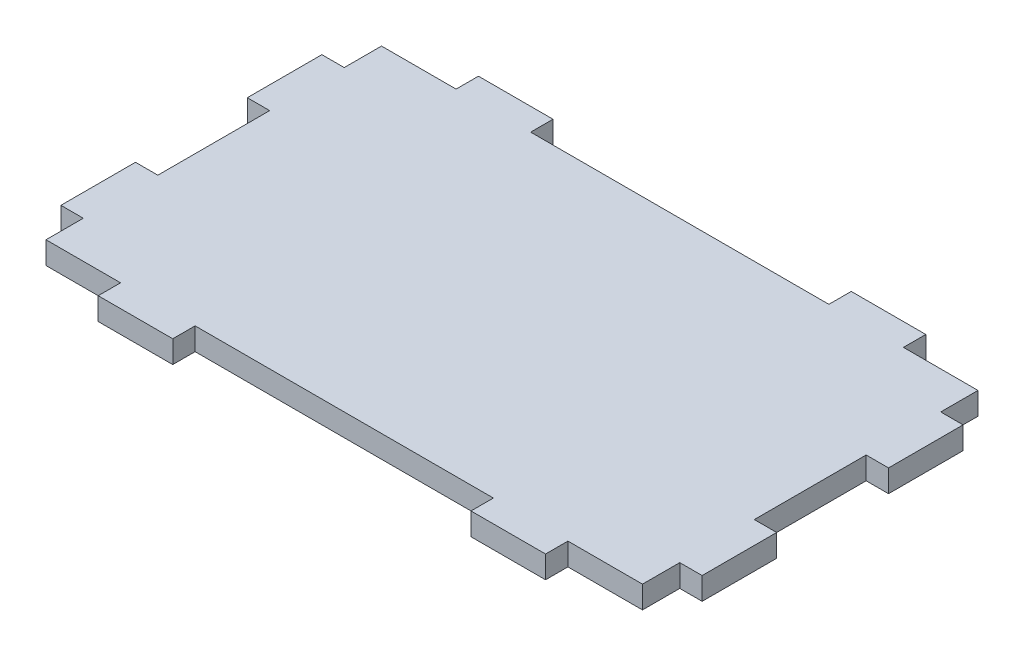
ISO-10303-21;
HEADER;
FILE_DESCRIPTION(('STEP AP214'),'2;1');
FILE_NAME('part.step','',(''),(''),'','','');
FILE_SCHEMA(('AUTOMOTIVE_DESIGN { 1 0 10303 214 1 1 1 1 }'));
ENDSEC;
DATA;
#1=APPLICATION_CONTEXT('core data for automotive mechanical design processes');
#2=APPLICATION_PROTOCOL_DEFINITION('international standard','automotive_design',2000,#1);
#3=PRODUCT_CONTEXT('',#1,'mechanical');
#4=PRODUCT('Part','Part','',(#3));
#5=PRODUCT_RELATED_PRODUCT_CATEGORY('part','',(#4));
#6=PRODUCT_DEFINITION_FORMATION('','',#4);
#7=PRODUCT_DEFINITION_CONTEXT('part definition',#1,'design');
#8=PRODUCT_DEFINITION('design','',#6,#7);
#9=PRODUCT_DEFINITION_SHAPE('','',#8);
#10=(LENGTH_UNIT() NAMED_UNIT(*) SI_UNIT(.MILLI.,.METRE.));
#11=(NAMED_UNIT(*) PLANE_ANGLE_UNIT() SI_UNIT($,.RADIAN.));
#12=(NAMED_UNIT(*) SI_UNIT($,.STERADIAN.) SOLID_ANGLE_UNIT());
#13=UNCERTAINTY_MEASURE_WITH_UNIT(LENGTH_MEASURE(1.E-05),#10,'distance_accuracy_value','');
#14=(GEOMETRIC_REPRESENTATION_CONTEXT(3) GLOBAL_UNCERTAINTY_ASSIGNED_CONTEXT((#13)) GLOBAL_UNIT_ASSIGNED_CONTEXT((#10,
#11,#12)) REPRESENTATION_CONTEXT('',''));
#15=CARTESIAN_POINT('',(0.,0.,0.));
#16=DIRECTION('',(0.,0.,1.));
#17=DIRECTION('',(1.,0.,0.));
#18=AXIS2_PLACEMENT_3D('',#15,#16,#17);
#19=CARTESIAN_POINT('',(0.,3.,0.));
#20=DIRECTION('',(1.,0.,0.));
#21=DIRECTION('',(0.,0.,-1.));
#22=AXIS2_PLACEMENT_3D('',#19,#20,#21);
#23=PLANE('',#22);
#24=DIRECTION('',(0.,0.,1.));
#25=VECTOR('',#24,1.);
#26=CARTESIAN_POINT('',(0.,0.,0.));
#27=LINE('',#26,#25);
#28=CARTESIAN_POINT('',(0.,0.,-5.));
#29=VERTEX_POINT('',#28);
#30=CARTESIAN_POINT('',(0.,0.,0.));
#31=VERTEX_POINT('',#30);
#32=EDGE_CURVE('E297',#29,#31,#27,.T.);
#33=ORIENTED_EDGE('',*,*,#32,.T.);
#34=DIRECTION('',(0.,-1.,0.));
#35=VECTOR('',#34,1.);
#36=CARTESIAN_POINT('',(0.,3.,0.));
#37=LINE('',#36,#35);
#38=CARTESIAN_POINT('',(0.,3.,0.));
#39=VERTEX_POINT('',#38);
#40=EDGE_CURVE('E11',#39,#31,#37,.T.);
#41=ORIENTED_EDGE('',*,*,#40,.F.);
#42=DIRECTION('',(0.,0.,1.));
#43=VECTOR('',#42,1.);
#44=CARTESIAN_POINT('',(0.,3.,0.));
#45=LINE('',#44,#43);
#46=CARTESIAN_POINT('',(0.,3.,-5.));
#47=VERTEX_POINT('',#46);
#48=EDGE_CURVE('E367',#47,#39,#45,.T.);
#49=ORIENTED_EDGE('',*,*,#48,.F.);
#50=DIRECTION('',(0.,-1.,0.));
#51=VECTOR('',#50,1.);
#52=CARTESIAN_POINT('',(0.,3.,-5.));
#53=LINE('',#52,#51);
#54=EDGE_CURVE('E293',#47,#29,#53,.T.);
#55=ORIENTED_EDGE('',*,*,#54,.T.);
#56=EDGE_LOOP('',(#33,#41,#49,#55));
#57=FACE_BOUND('',#56,.T.);
#58=ADVANCED_FACE('F33',(#57),#23,.F.);
#59=CARTESIAN_POINT('',(0.,3.,0.));
#60=DIRECTION('',(0.,0.,-1.));
#61=DIRECTION('',(-1.,0.,0.));
#62=AXIS2_PLACEMENT_3D('',#59,#60,#61);
#63=PLANE('',#62);
#64=DIRECTION('',(1.,0.,0.));
#65=VECTOR('',#64,1.);
#66=CARTESIAN_POINT('',(0.,0.,0.));
#67=LINE('',#66,#65);
#68=CARTESIAN_POINT('',(10.,0.,0.));
#69=VERTEX_POINT('',#68);
#70=EDGE_CURVE('E300',#31,#69,#67,.T.);
#71=ORIENTED_EDGE('',*,*,#70,.T.);
#72=DIRECTION('',(0.,-1.,0.));
#73=VECTOR('',#72,1.);
#74=CARTESIAN_POINT('',(10.,3.,0.));
#75=LINE('',#74,#73);
#76=CARTESIAN_POINT('',(10.,3.,0.));
#77=VERTEX_POINT('',#76);
#78=EDGE_CURVE('E41',#77,#69,#75,.T.);
#79=ORIENTED_EDGE('',*,*,#78,.F.);
#80=DIRECTION('',(1.,0.,0.));
#81=VECTOR('',#80,1.);
#82=CARTESIAN_POINT('',(0.,3.,0.));
#83=LINE('',#82,#81);
#84=EDGE_CURVE('E176',#39,#77,#83,.T.);
#85=ORIENTED_EDGE('',*,*,#84,.F.);
#86=ORIENTED_EDGE('',*,*,#40,.T.);
#87=EDGE_LOOP('',(#71,#79,#85,#86));
#88=FACE_BOUND('',#87,.T.);
#89=ADVANCED_FACE('F565',(#88),#63,.F.);
#90=CARTESIAN_POINT('',(10.,3.,0.));
#91=DIRECTION('',(1.,0.,0.));
#92=DIRECTION('',(0.,0.,-1.));
#93=AXIS2_PLACEMENT_3D('',#90,#91,#92);
#94=PLANE('',#93);
#95=DIRECTION('',(0.,0.,1.));
#96=VECTOR('',#95,1.);
#97=CARTESIAN_POINT('',(10.,0.,0.));
#98=LINE('',#97,#96);
#99=CARTESIAN_POINT('',(10.,0.,3.));
#100=VERTEX_POINT('',#99);
#101=EDGE_CURVE('E302',#69,#100,#98,.T.);
#102=ORIENTED_EDGE('',*,*,#101,.T.);
#103=DIRECTION('',(0.,-1.,0.));
#104=VECTOR('',#103,1.);
#105=CARTESIAN_POINT('',(10.,3.,3.));
#106=LINE('',#105,#104);
#107=CARTESIAN_POINT('',(10.,3.,3.));
#108=VERTEX_POINT('',#107);
#109=EDGE_CURVE('E458',#108,#100,#106,.T.);
#110=ORIENTED_EDGE('',*,*,#109,.F.);
#111=DIRECTION('',(0.,0.,1.));
#112=VECTOR('',#111,1.);
#113=CARTESIAN_POINT('',(10.,3.,0.));
#114=LINE('',#113,#112);
#115=EDGE_CURVE('E466',#77,#108,#114,.T.);
#116=ORIENTED_EDGE('',*,*,#115,.F.);
#117=ORIENTED_EDGE('',*,*,#78,.T.);
#118=EDGE_LOOP('',(#102,#110,#116,#117));
#119=FACE_BOUND('',#118,.T.);
#120=ADVANCED_FACE('F464',(#119),#94,.F.);
#121=CARTESIAN_POINT('',(10.,3.,3.));
#122=DIRECTION('',(0.,0.,-1.));
#123=DIRECTION('',(-1.,0.,0.));
#124=AXIS2_PLACEMENT_3D('',#121,#122,#123);
#125=PLANE('',#124);
#126=DIRECTION('',(1.,0.,0.));
#127=VECTOR('',#126,1.);
#128=CARTESIAN_POINT('',(10.,0.,3.));
#129=LINE('',#128,#127);
#130=CARTESIAN_POINT('',(20.,0.,3.));
#131=VERTEX_POINT('',#130);
#132=EDGE_CURVE('E304',#100,#131,#129,.T.);
#133=ORIENTED_EDGE('',*,*,#132,.T.);
#134=DIRECTION('',(0.,-1.,0.));
#135=VECTOR('',#134,1.);
#136=CARTESIAN_POINT('',(20.,3.,3.));
#137=LINE('',#136,#135);
#138=CARTESIAN_POINT('',(20.,3.,3.));
#139=VERTEX_POINT('',#138);
#140=EDGE_CURVE('E455',#139,#131,#137,.T.);
#141=ORIENTED_EDGE('',*,*,#140,.F.);
#142=DIRECTION('',(1.,0.,0.));
#143=VECTOR('',#142,1.);
#144=CARTESIAN_POINT('',(10.,3.,3.));
#145=LINE('',#144,#143);
#146=EDGE_CURVE('E484',#108,#139,#145,.T.);
#147=ORIENTED_EDGE('',*,*,#146,.F.);
#148=ORIENTED_EDGE('',*,*,#109,.T.);
#149=EDGE_LOOP('',(#133,#141,#147,#148));
#150=FACE_BOUND('',#149,.T.);
#151=ADVANCED_FACE('F475',(#150),#125,.F.);
#152=CARTESIAN_POINT('',(20.,3.,0.));
#153=DIRECTION('',(-1.,0.,0.));
#154=DIRECTION('',(0.,0.,1.));
#155=AXIS2_PLACEMENT_3D('',#152,#153,#154);
#156=PLANE('',#155);
#157=DIRECTION('',(0.,0.,-1.));
#158=VECTOR('',#157,1.);
#159=CARTESIAN_POINT('',(20.,0.,0.));
#160=LINE('',#159,#158);
#161=CARTESIAN_POINT('',(20.,0.,0.));
#162=VERTEX_POINT('',#161);
#163=EDGE_CURVE('E306',#131,#162,#160,.T.);
#164=ORIENTED_EDGE('',*,*,#163,.T.);
#165=DIRECTION('',(0.,-1.,0.));
#166=VECTOR('',#165,1.);
#167=CARTESIAN_POINT('',(20.,3.,0.));
#168=LINE('',#167,#166);
#169=CARTESIAN_POINT('',(20.,3.,0.));
#170=VERTEX_POINT('',#169);
#171=EDGE_CURVE('E452',#170,#162,#168,.T.);
#172=ORIENTED_EDGE('',*,*,#171,.F.);
#173=DIRECTION('',(0.,0.,-1.));
#174=VECTOR('',#173,1.);
#175=CARTESIAN_POINT('',(20.,3.,0.));
#176=LINE('',#175,#174);
#177=EDGE_CURVE('E481',#139,#170,#176,.T.);
#178=ORIENTED_EDGE('',*,*,#177,.F.);
#179=ORIENTED_EDGE('',*,*,#140,.T.);
#180=EDGE_LOOP('',(#164,#172,#178,#179));
#181=FACE_BOUND('',#180,.T.);
#182=ADVANCED_FACE('F479',(#181),#156,.F.);
#183=CARTESIAN_POINT('',(20.,3.,0.));
#184=DIRECTION('',(0.,0.,-1.));
#185=DIRECTION('',(-1.,0.,0.));
#186=AXIS2_PLACEMENT_3D('',#183,#184,#185);
#187=PLANE('',#186);
#188=DIRECTION('',(1.,0.,0.));
#189=VECTOR('',#188,1.);
#190=CARTESIAN_POINT('',(20.,0.,0.));
#191=LINE('',#190,#189);
#192=CARTESIAN_POINT('',(60.,0.,0.));
#193=VERTEX_POINT('',#192);
#194=EDGE_CURVE('E308',#162,#193,#191,.T.);
#195=ORIENTED_EDGE('',*,*,#194,.T.);
#196=DIRECTION('',(0.,-1.,0.));
#197=VECTOR('',#196,1.);
#198=CARTESIAN_POINT('',(60.,3.,0.));
#199=LINE('',#198,#197);
#200=CARTESIAN_POINT('',(60.,3.,0.));
#201=VERTEX_POINT('',#200);
#202=EDGE_CURVE('E449',#201,#193,#199,.T.);
#203=ORIENTED_EDGE('',*,*,#202,.F.);
#204=DIRECTION('',(1.,0.,0.));
#205=VECTOR('',#204,1.);
#206=CARTESIAN_POINT('',(20.,3.,0.));
#207=LINE('',#206,#205);
#208=EDGE_CURVE('E483',#170,#201,#207,.T.);
#209=ORIENTED_EDGE('',*,*,#208,.F.);
#210=ORIENTED_EDGE('',*,*,#171,.T.);
#211=EDGE_LOOP('',(#195,#203,#209,#210));
#212=FACE_BOUND('',#211,.T.);
#213=ADVANCED_FACE('F578',(#212),#187,.F.);
#214=CARTESIAN_POINT('',(60.,3.,0.));
#215=DIRECTION('',(1.,0.,0.));
#216=DIRECTION('',(0.,0.,-1.));
#217=AXIS2_PLACEMENT_3D('',#214,#215,#216);
#218=PLANE('',#217);
#219=DIRECTION('',(0.,0.,1.));
#220=VECTOR('',#219,1.);
#221=CARTESIAN_POINT('',(60.,0.,0.));
#222=LINE('',#221,#220);
#223=CARTESIAN_POINT('',(60.,0.,3.));
#224=VERTEX_POINT('',#223);
#225=EDGE_CURVE('E310',#193,#224,#222,.T.);
#226=ORIENTED_EDGE('',*,*,#225,.T.);
#227=DIRECTION('',(0.,-1.,0.));
#228=VECTOR('',#227,1.);
#229=CARTESIAN_POINT('',(60.,3.,3.));
#230=LINE('',#229,#228);
#231=CARTESIAN_POINT('',(60.,3.,3.));
#232=VERTEX_POINT('',#231);
#233=EDGE_CURVE('E446',#232,#224,#230,.T.);
#234=ORIENTED_EDGE('',*,*,#233,.F.);
#235=DIRECTION('',(0.,0.,1.));
#236=VECTOR('',#235,1.);
#237=CARTESIAN_POINT('',(60.,3.,0.));
#238=LINE('',#237,#236);
#239=EDGE_CURVE('E486',#201,#232,#238,.T.);
#240=ORIENTED_EDGE('',*,*,#239,.F.);
#241=ORIENTED_EDGE('',*,*,#202,.T.);
#242=EDGE_LOOP('',(#226,#234,#240,#241));
#243=FACE_BOUND('',#242,.T.);
#244=ADVANCED_FACE('F581',(#243),#218,.F.);
#245=CARTESIAN_POINT('',(60.,3.,3.));
#246=DIRECTION('',(0.,0.,-1.));
#247=DIRECTION('',(-1.,0.,0.));
#248=AXIS2_PLACEMENT_3D('',#245,#246,#247);
#249=PLANE('',#248);
#250=DIRECTION('',(1.,0.,0.));
#251=VECTOR('',#250,1.);
#252=CARTESIAN_POINT('',(60.,0.,3.));
#253=LINE('',#252,#251);
#254=CARTESIAN_POINT('',(70.,0.,3.));
#255=VERTEX_POINT('',#254);
#256=EDGE_CURVE('E312',#224,#255,#253,.T.);
#257=ORIENTED_EDGE('',*,*,#256,.T.);
#258=DIRECTION('',(0.,-1.,0.));
#259=VECTOR('',#258,1.);
#260=CARTESIAN_POINT('',(70.,3.,3.));
#261=LINE('',#260,#259);
#262=CARTESIAN_POINT('',(70.,3.,3.));
#263=VERTEX_POINT('',#262);
#264=EDGE_CURVE('E443',#263,#255,#261,.T.);
#265=ORIENTED_EDGE('',*,*,#264,.F.);
#266=DIRECTION('',(1.,0.,0.));
#267=VECTOR('',#266,1.);
#268=CARTESIAN_POINT('',(60.,3.,3.));
#269=LINE('',#268,#267);
#270=EDGE_CURVE('E492',#232,#263,#269,.T.);
#271=ORIENTED_EDGE('',*,*,#270,.F.);
#272=ORIENTED_EDGE('',*,*,#233,.T.);
#273=EDGE_LOOP('',(#257,#265,#271,#272));
#274=FACE_BOUND('',#273,.T.);
#275=ADVANCED_FACE('F585',(#274),#249,.F.);
#276=CARTESIAN_POINT('',(70.,3.,0.));
#277=DIRECTION('',(-1.,0.,0.));
#278=DIRECTION('',(0.,0.,1.));
#279=AXIS2_PLACEMENT_3D('',#276,#277,#278);
#280=PLANE('',#279);
#281=DIRECTION('',(0.,0.,-1.));
#282=VECTOR('',#281,1.);
#283=CARTESIAN_POINT('',(70.,0.,0.));
#284=LINE('',#283,#282);
#285=CARTESIAN_POINT('',(70.,0.,0.));
#286=VERTEX_POINT('',#285);
#287=EDGE_CURVE('E314',#255,#286,#284,.T.);
#288=ORIENTED_EDGE('',*,*,#287,.T.);
#289=DIRECTION('',(0.,-1.,0.));
#290=VECTOR('',#289,1.);
#291=CARTESIAN_POINT('',(70.,3.,0.));
#292=LINE('',#291,#290);
#293=CARTESIAN_POINT('',(70.,3.,0.));
#294=VERTEX_POINT('',#293);
#295=EDGE_CURVE('E440',#294,#286,#292,.T.);
#296=ORIENTED_EDGE('',*,*,#295,.F.);
#297=DIRECTION('',(0.,0.,-1.));
#298=VECTOR('',#297,1.);
#299=CARTESIAN_POINT('',(70.,3.,0.));
#300=LINE('',#299,#298);
#301=EDGE_CURVE('E494',#263,#294,#300,.T.);
#302=ORIENTED_EDGE('',*,*,#301,.F.);
#303=ORIENTED_EDGE('',*,*,#264,.T.);
#304=EDGE_LOOP('',(#288,#296,#302,#303));
#305=FACE_BOUND('',#304,.T.);
#306=ADVANCED_FACE('F589',(#305),#280,.F.);
#307=CARTESIAN_POINT('',(70.,3.,0.));
#308=DIRECTION('',(0.,0.,-1.));
#309=DIRECTION('',(-1.,0.,0.));
#310=AXIS2_PLACEMENT_3D('',#307,#308,#309);
#311=PLANE('',#310);
#312=DIRECTION('',(1.,0.,0.));
#313=VECTOR('',#312,1.);
#314=CARTESIAN_POINT('',(70.,0.,0.));
#315=LINE('',#314,#313);
#316=CARTESIAN_POINT('',(80.,0.,0.));
#317=VERTEX_POINT('',#316);
#318=EDGE_CURVE('E316',#286,#317,#315,.T.);
#319=ORIENTED_EDGE('',*,*,#318,.T.);
#320=DIRECTION('',(0.,-1.,0.));
#321=VECTOR('',#320,1.);
#322=CARTESIAN_POINT('',(80.,3.,0.));
#323=LINE('',#322,#321);
#324=CARTESIAN_POINT('',(80.,3.,0.));
#325=VERTEX_POINT('',#324);
#326=EDGE_CURVE('E437',#325,#317,#323,.T.);
#327=ORIENTED_EDGE('',*,*,#326,.F.);
#328=DIRECTION('',(1.,0.,0.));
#329=VECTOR('',#328,1.);
#330=CARTESIAN_POINT('',(70.,3.,0.));
#331=LINE('',#330,#329);
#332=EDGE_CURVE('E496',#294,#325,#331,.T.);
#333=ORIENTED_EDGE('',*,*,#332,.F.);
#334=ORIENTED_EDGE('',*,*,#295,.T.);
#335=EDGE_LOOP('',(#319,#327,#333,#334));
#336=FACE_BOUND('',#335,.T.);
#337=ADVANCED_FACE('F593',(#336),#311,.F.);
#338=CARTESIAN_POINT('',(80.,3.,0.));
#339=DIRECTION('',(-1.,0.,0.));
#340=DIRECTION('',(0.,0.,1.));
#341=AXIS2_PLACEMENT_3D('',#338,#339,#340);
#342=PLANE('',#341);
#343=DIRECTION('',(0.,0.,-1.));
#344=VECTOR('',#343,1.);
#345=CARTESIAN_POINT('',(80.,0.,0.));
#346=LINE('',#345,#344);
#347=CARTESIAN_POINT('',(80.,0.,-5.));
#348=VERTEX_POINT('',#347);
#349=EDGE_CURVE('E318',#317,#348,#346,.T.);
#350=ORIENTED_EDGE('',*,*,#349,.T.);
#351=DIRECTION('',(0.,-1.,0.));
#352=VECTOR('',#351,1.);
#353=CARTESIAN_POINT('',(80.,3.,-5.));
#354=LINE('',#353,#352);
#355=CARTESIAN_POINT('',(80.,3.,-5.));
#356=VERTEX_POINT('',#355);
#357=EDGE_CURVE('E434',#356,#348,#354,.T.);
#358=ORIENTED_EDGE('',*,*,#357,.F.);
#359=DIRECTION('',(0.,0.,-1.));
#360=VECTOR('',#359,1.);
#361=CARTESIAN_POINT('',(80.,3.,0.));
#362=LINE('',#361,#360);
#363=EDGE_CURVE('E498',#325,#356,#362,.T.);
#364=ORIENTED_EDGE('',*,*,#363,.F.);
#365=ORIENTED_EDGE('',*,*,#326,.T.);
#366=EDGE_LOOP('',(#350,#358,#364,#365));
#367=FACE_BOUND('',#366,.T.);
#368=ADVANCED_FACE('F597',(#367),#342,.F.);
#369=CARTESIAN_POINT('',(80.,3.,-5.));
#370=DIRECTION('',(0.,0.,-1.));
#371=DIRECTION('',(-1.,0.,0.));
#372=AXIS2_PLACEMENT_3D('',#369,#370,#371);
#373=PLANE('',#372);
#374=DIRECTION('',(1.,0.,0.));
#375=VECTOR('',#374,1.);
#376=CARTESIAN_POINT('',(80.,0.,-5.));
#377=LINE('',#376,#375);
#378=CARTESIAN_POINT('',(83.,0.,-5.));
#379=VERTEX_POINT('',#378);
#380=EDGE_CURVE('E320',#348,#379,#377,.T.);
#381=ORIENTED_EDGE('',*,*,#380,.T.);
#382=DIRECTION('',(0.,-1.,0.));
#383=VECTOR('',#382,1.);
#384=CARTESIAN_POINT('',(83.,3.,-5.));
#385=LINE('',#384,#383);
#386=CARTESIAN_POINT('',(83.,3.,-5.));
#387=VERTEX_POINT('',#386);
#388=EDGE_CURVE('E431',#387,#379,#385,.T.);
#389=ORIENTED_EDGE('',*,*,#388,.F.);
#390=DIRECTION('',(1.,0.,0.));
#391=VECTOR('',#390,1.);
#392=CARTESIAN_POINT('',(80.,3.,-5.));
#393=LINE('',#392,#391);
#394=EDGE_CURVE('E500',#356,#387,#393,.T.);
#395=ORIENTED_EDGE('',*,*,#394,.F.);
#396=ORIENTED_EDGE('',*,*,#357,.T.);
#397=EDGE_LOOP('',(#381,#389,#395,#396));
#398=FACE_BOUND('',#397,.T.);
#399=ADVANCED_FACE('F601',(#398),#373,.F.);
#400=CARTESIAN_POINT('',(83.,3.,-15.));
#401=DIRECTION('',(-1.,0.,0.));
#402=DIRECTION('',(0.,0.,1.));
#403=AXIS2_PLACEMENT_3D('',#400,#401,#402);
#404=PLANE('',#403);
#405=DIRECTION('',(0.,0.,-1.));
#406=VECTOR('',#405,1.);
#407=CARTESIAN_POINT('',(83.,0.,-15.));
#408=LINE('',#407,#406);
#409=CARTESIAN_POINT('',(83.,0.,-15.));
#410=VERTEX_POINT('',#409);
#411=EDGE_CURVE('E322',#379,#410,#408,.T.);
#412=ORIENTED_EDGE('',*,*,#411,.T.);
#413=DIRECTION('',(0.,-1.,0.));
#414=VECTOR('',#413,1.);
#415=CARTESIAN_POINT('',(83.,3.,-15.));
#416=LINE('',#415,#414);
#417=CARTESIAN_POINT('',(83.,3.,-15.));
#418=VERTEX_POINT('',#417);
#419=EDGE_CURVE('E428',#418,#410,#416,.T.);
#420=ORIENTED_EDGE('',*,*,#419,.F.);
#421=DIRECTION('',(0.,0.,-1.));
#422=VECTOR('',#421,1.);
#423=CARTESIAN_POINT('',(83.,3.,-15.));
#424=LINE('',#423,#422);
#425=EDGE_CURVE('E502',#387,#418,#424,.T.);
#426=ORIENTED_EDGE('',*,*,#425,.F.);
#427=ORIENTED_EDGE('',*,*,#388,.T.);
#428=EDGE_LOOP('',(#412,#420,#426,#427));
#429=FACE_BOUND('',#428,.T.);
#430=ADVANCED_FACE('F605',(#429),#404,.F.);
#431=CARTESIAN_POINT('',(80.,3.,-15.));
#432=DIRECTION('',(0.,0.,1.));
#433=DIRECTION('',(1.,0.,0.));
#434=AXIS2_PLACEMENT_3D('',#431,#432,#433);
#435=PLANE('',#434);
#436=DIRECTION('',(-1.,0.,0.));
#437=VECTOR('',#436,1.);
#438=CARTESIAN_POINT('',(80.,0.,-15.));
#439=LINE('',#438,#437);
#440=CARTESIAN_POINT('',(80.,0.,-15.));
#441=VERTEX_POINT('',#440);
#442=EDGE_CURVE('E324',#410,#441,#439,.T.);
#443=ORIENTED_EDGE('',*,*,#442,.T.);
#444=DIRECTION('',(0.,-1.,0.));
#445=VECTOR('',#444,1.);
#446=CARTESIAN_POINT('',(80.,3.,-15.));
#447=LINE('',#446,#445);
#448=CARTESIAN_POINT('',(80.,3.,-15.));
#449=VERTEX_POINT('',#448);
#450=EDGE_CURVE('E425',#449,#441,#447,.T.);
#451=ORIENTED_EDGE('',*,*,#450,.F.);
#452=DIRECTION('',(-1.,0.,0.));
#453=VECTOR('',#452,1.);
#454=CARTESIAN_POINT('',(80.,3.,-15.));
#455=LINE('',#454,#453);
#456=EDGE_CURVE('E504',#418,#449,#455,.T.);
#457=ORIENTED_EDGE('',*,*,#456,.F.);
#458=ORIENTED_EDGE('',*,*,#419,.T.);
#459=EDGE_LOOP('',(#443,#451,#457,#458));
#460=FACE_BOUND('',#459,.T.);
#461=ADVANCED_FACE('F609',(#460),#435,.F.);
#462=CARTESIAN_POINT('',(80.,3.,-15.));
#463=DIRECTION('',(-1.,0.,0.));
#464=DIRECTION('',(0.,0.,1.));
#465=AXIS2_PLACEMENT_3D('',#462,#463,#464);
#466=PLANE('',#465);
#467=DIRECTION('',(0.,0.,-1.));
#468=VECTOR('',#467,1.);
#469=CARTESIAN_POINT('',(80.,0.,-15.));
#470=LINE('',#469,#468);
#471=CARTESIAN_POINT('',(80.,0.,-30.));
#472=VERTEX_POINT('',#471);
#473=EDGE_CURVE('E326',#441,#472,#470,.T.);
#474=ORIENTED_EDGE('',*,*,#473,.T.);
#475=DIRECTION('',(0.,-1.,0.));
#476=VECTOR('',#475,1.);
#477=CARTESIAN_POINT('',(80.,3.,-30.));
#478=LINE('',#477,#476);
#479=CARTESIAN_POINT('',(80.,3.,-30.));
#480=VERTEX_POINT('',#479);
#481=EDGE_CURVE('E422',#480,#472,#478,.T.);
#482=ORIENTED_EDGE('',*,*,#481,.F.);
#483=DIRECTION('',(0.,0.,-1.));
#484=VECTOR('',#483,1.);
#485=CARTESIAN_POINT('',(80.,3.,-15.));
#486=LINE('',#485,#484);
#487=EDGE_CURVE('E506',#449,#480,#486,.T.);
#488=ORIENTED_EDGE('',*,*,#487,.F.);
#489=ORIENTED_EDGE('',*,*,#450,.T.);
#490=EDGE_LOOP('',(#474,#482,#488,#489));
#491=FACE_BOUND('',#490,.T.);
#492=ADVANCED_FACE('F613',(#491),#466,.F.);
#493=CARTESIAN_POINT('',(80.,3.,-30.));
#494=DIRECTION('',(0.,0.,-1.));
#495=DIRECTION('',(-1.,0.,0.));
#496=AXIS2_PLACEMENT_3D('',#493,#494,#495);
#497=PLANE('',#496);
#498=DIRECTION('',(1.,0.,0.));
#499=VECTOR('',#498,1.);
#500=CARTESIAN_POINT('',(80.,0.,-30.));
#501=LINE('',#500,#499);
#502=CARTESIAN_POINT('',(83.,0.,-30.));
#503=VERTEX_POINT('',#502);
#504=EDGE_CURVE('E328',#472,#503,#501,.T.);
#505=ORIENTED_EDGE('',*,*,#504,.T.);
#506=DIRECTION('',(0.,-1.,0.));
#507=VECTOR('',#506,1.);
#508=CARTESIAN_POINT('',(83.,3.,-30.));
#509=LINE('',#508,#507);
#510=CARTESIAN_POINT('',(83.,3.,-30.));
#511=VERTEX_POINT('',#510);
#512=EDGE_CURVE('E419',#511,#503,#509,.T.);
#513=ORIENTED_EDGE('',*,*,#512,.F.);
#514=DIRECTION('',(1.,0.,0.));
#515=VECTOR('',#514,1.);
#516=CARTESIAN_POINT('',(80.,3.,-30.));
#517=LINE('',#516,#515);
#518=EDGE_CURVE('E508',#480,#511,#517,.T.);
#519=ORIENTED_EDGE('',*,*,#518,.F.);
#520=ORIENTED_EDGE('',*,*,#481,.T.);
#521=EDGE_LOOP('',(#505,#513,#519,#520));
#522=FACE_BOUND('',#521,.T.);
#523=ADVANCED_FACE('F617',(#522),#497,.F.);
#524=CARTESIAN_POINT('',(83.,3.,-40.));
#525=DIRECTION('',(-1.,0.,0.));
#526=DIRECTION('',(0.,0.,1.));
#527=AXIS2_PLACEMENT_3D('',#524,#525,#526);
#528=PLANE('',#527);
#529=DIRECTION('',(0.,0.,-1.));
#530=VECTOR('',#529,1.);
#531=CARTESIAN_POINT('',(83.,0.,-40.));
#532=LINE('',#531,#530);
#533=CARTESIAN_POINT('',(83.,0.,-40.));
#534=VERTEX_POINT('',#533);
#535=EDGE_CURVE('E330',#503,#534,#532,.T.);
#536=ORIENTED_EDGE('',*,*,#535,.T.);
#537=DIRECTION('',(0.,-1.,0.));
#538=VECTOR('',#537,1.);
#539=CARTESIAN_POINT('',(83.,3.,-40.));
#540=LINE('',#539,#538);
#541=CARTESIAN_POINT('',(83.,3.,-40.));
#542=VERTEX_POINT('',#541);
#543=EDGE_CURVE('E416',#542,#534,#540,.T.);
#544=ORIENTED_EDGE('',*,*,#543,.F.);
#545=DIRECTION('',(0.,0.,-1.));
#546=VECTOR('',#545,1.);
#547=CARTESIAN_POINT('',(83.,3.,-40.));
#548=LINE('',#547,#546);
#549=EDGE_CURVE('E510',#511,#542,#548,.T.);
#550=ORIENTED_EDGE('',*,*,#549,.F.);
#551=ORIENTED_EDGE('',*,*,#512,.T.);
#552=EDGE_LOOP('',(#536,#544,#550,#551));
#553=FACE_BOUND('',#552,.T.);
#554=ADVANCED_FACE('F621',(#553),#528,.F.);
#555=CARTESIAN_POINT('',(80.,3.,-40.));
#556=DIRECTION('',(0.,0.,1.));
#557=DIRECTION('',(1.,0.,0.));
#558=AXIS2_PLACEMENT_3D('',#555,#556,#557);
#559=PLANE('',#558);
#560=DIRECTION('',(-1.,0.,0.));
#561=VECTOR('',#560,1.);
#562=CARTESIAN_POINT('',(80.,0.,-40.));
#563=LINE('',#562,#561);
#564=CARTESIAN_POINT('',(80.,0.,-40.));
#565=VERTEX_POINT('',#564);
#566=EDGE_CURVE('E332',#534,#565,#563,.T.);
#567=ORIENTED_EDGE('',*,*,#566,.T.);
#568=DIRECTION('',(0.,-1.,0.));
#569=VECTOR('',#568,1.);
#570=CARTESIAN_POINT('',(80.,3.,-40.));
#571=LINE('',#570,#569);
#572=CARTESIAN_POINT('',(80.,3.,-40.));
#573=VERTEX_POINT('',#572);
#574=EDGE_CURVE('E413',#573,#565,#571,.T.);
#575=ORIENTED_EDGE('',*,*,#574,.F.);
#576=DIRECTION('',(-1.,0.,0.));
#577=VECTOR('',#576,1.);
#578=CARTESIAN_POINT('',(80.,3.,-40.));
#579=LINE('',#578,#577);
#580=EDGE_CURVE('E512',#542,#573,#579,.T.);
#581=ORIENTED_EDGE('',*,*,#580,.F.);
#582=ORIENTED_EDGE('',*,*,#543,.T.);
#583=EDGE_LOOP('',(#567,#575,#581,#582));
#584=FACE_BOUND('',#583,.T.);
#585=ADVANCED_FACE('F625',(#584),#559,.F.);
#586=CARTESIAN_POINT('',(80.,3.,-40.));
#587=DIRECTION('',(-1.,0.,0.));
#588=DIRECTION('',(0.,0.,1.));
#589=AXIS2_PLACEMENT_3D('',#586,#587,#588);
#590=PLANE('',#589);
#591=DIRECTION('',(0.,0.,-1.));
#592=VECTOR('',#591,1.);
#593=CARTESIAN_POINT('',(80.,0.,-40.));
#594=LINE('',#593,#592);
#595=CARTESIAN_POINT('',(80.,0.,-45.));
#596=VERTEX_POINT('',#595);
#597=EDGE_CURVE('E334',#565,#596,#594,.T.);
#598=ORIENTED_EDGE('',*,*,#597,.T.);
#599=DIRECTION('',(0.,-1.,0.));
#600=VECTOR('',#599,1.);
#601=CARTESIAN_POINT('',(80.,3.,-45.));
#602=LINE('',#601,#600);
#603=CARTESIAN_POINT('',(80.,3.,-45.));
#604=VERTEX_POINT('',#603);
#605=EDGE_CURVE('E410',#604,#596,#602,.T.);
#606=ORIENTED_EDGE('',*,*,#605,.F.);
#607=DIRECTION('',(0.,0.,-1.));
#608=VECTOR('',#607,1.);
#609=CARTESIAN_POINT('',(80.,3.,-40.));
#610=LINE('',#609,#608);
#611=EDGE_CURVE('E514',#573,#604,#610,.T.);
#612=ORIENTED_EDGE('',*,*,#611,.F.);
#613=ORIENTED_EDGE('',*,*,#574,.T.);
#614=EDGE_LOOP('',(#598,#606,#612,#613));
#615=FACE_BOUND('',#614,.T.);
#616=ADVANCED_FACE('F629',(#615),#590,.F.);
#617=CARTESIAN_POINT('',(70.,3.,-45.));
#618=DIRECTION('',(0.,0.,1.));
#619=DIRECTION('',(1.,0.,0.));
#620=AXIS2_PLACEMENT_3D('',#617,#618,#619);
#621=PLANE('',#620);
#622=DIRECTION('',(-1.,0.,0.));
#623=VECTOR('',#622,1.);
#624=CARTESIAN_POINT('',(70.,0.,-45.));
#625=LINE('',#624,#623);
#626=CARTESIAN_POINT('',(70.,0.,-45.));
#627=VERTEX_POINT('',#626);
#628=EDGE_CURVE('E336',#596,#627,#625,.T.);
#629=ORIENTED_EDGE('',*,*,#628,.T.);
#630=DIRECTION('',(0.,-1.,0.));
#631=VECTOR('',#630,1.);
#632=CARTESIAN_POINT('',(70.,3.,-45.));
#633=LINE('',#632,#631);
#634=CARTESIAN_POINT('',(70.,3.,-45.));
#635=VERTEX_POINT('',#634);
#636=EDGE_CURVE('E407',#635,#627,#633,.T.);
#637=ORIENTED_EDGE('',*,*,#636,.F.);
#638=DIRECTION('',(-1.,0.,0.));
#639=VECTOR('',#638,1.);
#640=CARTESIAN_POINT('',(70.,3.,-45.));
#641=LINE('',#640,#639);
#642=EDGE_CURVE('E516',#604,#635,#641,.T.);
#643=ORIENTED_EDGE('',*,*,#642,.F.);
#644=ORIENTED_EDGE('',*,*,#605,.T.);
#645=EDGE_LOOP('',(#629,#637,#643,#644));
#646=FACE_BOUND('',#645,.T.);
#647=ADVANCED_FACE('F633',(#646),#621,.F.);
#648=CARTESIAN_POINT('',(70.,3.,-45.));
#649=DIRECTION('',(-1.,0.,0.));
#650=DIRECTION('',(0.,0.,1.));
#651=AXIS2_PLACEMENT_3D('',#648,#649,#650);
#652=PLANE('',#651);
#653=DIRECTION('',(0.,0.,-1.));
#654=VECTOR('',#653,1.);
#655=CARTESIAN_POINT('',(70.,0.,-45.));
#656=LINE('',#655,#654);
#657=CARTESIAN_POINT('',(70.,0.,-48.));
#658=VERTEX_POINT('',#657);
#659=EDGE_CURVE('E338',#627,#658,#656,.T.);
#660=ORIENTED_EDGE('',*,*,#659,.T.);
#661=DIRECTION('',(0.,-1.,0.));
#662=VECTOR('',#661,1.);
#663=CARTESIAN_POINT('',(70.,3.,-48.));
#664=LINE('',#663,#662);
#665=CARTESIAN_POINT('',(70.,3.,-48.));
#666=VERTEX_POINT('',#665);
#667=EDGE_CURVE('E404',#666,#658,#664,.T.);
#668=ORIENTED_EDGE('',*,*,#667,.F.);
#669=DIRECTION('',(0.,0.,-1.));
#670=VECTOR('',#669,1.);
#671=CARTESIAN_POINT('',(70.,3.,-45.));
#672=LINE('',#671,#670);
#673=EDGE_CURVE('E518',#635,#666,#672,.T.);
#674=ORIENTED_EDGE('',*,*,#673,.F.);
#675=ORIENTED_EDGE('',*,*,#636,.T.);
#676=EDGE_LOOP('',(#660,#668,#674,#675));
#677=FACE_BOUND('',#676,.T.);
#678=ADVANCED_FACE('F637',(#677),#652,.F.);
#679=CARTESIAN_POINT('',(60.,3.,-48.));
#680=DIRECTION('',(0.,0.,1.));
#681=DIRECTION('',(1.,0.,0.));
#682=AXIS2_PLACEMENT_3D('',#679,#680,#681);
#683=PLANE('',#682);
#684=DIRECTION('',(-1.,0.,0.));
#685=VECTOR('',#684,1.);
#686=CARTESIAN_POINT('',(60.,0.,-48.));
#687=LINE('',#686,#685);
#688=CARTESIAN_POINT('',(60.,0.,-48.));
#689=VERTEX_POINT('',#688);
#690=EDGE_CURVE('E340',#658,#689,#687,.T.);
#691=ORIENTED_EDGE('',*,*,#690,.T.);
#692=DIRECTION('',(0.,-1.,0.));
#693=VECTOR('',#692,1.);
#694=CARTESIAN_POINT('',(60.,3.,-48.));
#695=LINE('',#694,#693);
#696=CARTESIAN_POINT('',(60.,3.,-48.));
#697=VERTEX_POINT('',#696);
#698=EDGE_CURVE('E401',#697,#689,#695,.T.);
#699=ORIENTED_EDGE('',*,*,#698,.F.);
#700=DIRECTION('',(-1.,0.,0.));
#701=VECTOR('',#700,1.);
#702=CARTESIAN_POINT('',(60.,3.,-48.));
#703=LINE('',#702,#701);
#704=EDGE_CURVE('E520',#666,#697,#703,.T.);
#705=ORIENTED_EDGE('',*,*,#704,.F.);
#706=ORIENTED_EDGE('',*,*,#667,.T.);
#707=EDGE_LOOP('',(#691,#699,#705,#706));
#708=FACE_BOUND('',#707,.T.);
#709=ADVANCED_FACE('F641',(#708),#683,.F.);
#710=CARTESIAN_POINT('',(60.,3.,-45.));
#711=DIRECTION('',(1.,0.,0.));
#712=DIRECTION('',(0.,0.,-1.));
#713=AXIS2_PLACEMENT_3D('',#710,#711,#712);
#714=PLANE('',#713);
#715=DIRECTION('',(0.,0.,1.));
#716=VECTOR('',#715,1.);
#717=CARTESIAN_POINT('',(60.,0.,-45.));
#718=LINE('',#717,#716);
#719=CARTESIAN_POINT('',(60.,0.,-45.));
#720=VERTEX_POINT('',#719);
#721=EDGE_CURVE('E342',#689,#720,#718,.T.);
#722=ORIENTED_EDGE('',*,*,#721,.T.);
#723=DIRECTION('',(0.,-1.,0.));
#724=VECTOR('',#723,1.);
#725=CARTESIAN_POINT('',(60.,3.,-45.));
#726=LINE('',#725,#724);
#727=CARTESIAN_POINT('',(60.,3.,-45.));
#728=VERTEX_POINT('',#727);
#729=EDGE_CURVE('E398',#728,#720,#726,.T.);
#730=ORIENTED_EDGE('',*,*,#729,.F.);
#731=DIRECTION('',(0.,0.,1.));
#732=VECTOR('',#731,1.);
#733=CARTESIAN_POINT('',(60.,3.,-45.));
#734=LINE('',#733,#732);
#735=EDGE_CURVE('E522',#697,#728,#734,.T.);
#736=ORIENTED_EDGE('',*,*,#735,.F.);
#737=ORIENTED_EDGE('',*,*,#698,.T.);
#738=EDGE_LOOP('',(#722,#730,#736,#737));
#739=FACE_BOUND('',#738,.T.);
#740=ADVANCED_FACE('F645',(#739),#714,.F.);
#741=CARTESIAN_POINT('',(20.,3.,-45.));
#742=DIRECTION('',(0.,0.,1.));
#743=DIRECTION('',(1.,0.,0.));
#744=AXIS2_PLACEMENT_3D('',#741,#742,#743);
#745=PLANE('',#744);
#746=DIRECTION('',(-1.,0.,0.));
#747=VECTOR('',#746,1.);
#748=CARTESIAN_POINT('',(20.,0.,-45.));
#749=LINE('',#748,#747);
#750=CARTESIAN_POINT('',(20.,0.,-45.));
#751=VERTEX_POINT('',#750);
#752=EDGE_CURVE('E344',#720,#751,#749,.T.);
#753=ORIENTED_EDGE('',*,*,#752,.T.);
#754=DIRECTION('',(0.,-1.,0.));
#755=VECTOR('',#754,1.);
#756=CARTESIAN_POINT('',(20.,3.,-45.));
#757=LINE('',#756,#755);
#758=CARTESIAN_POINT('',(20.,3.,-45.));
#759=VERTEX_POINT('',#758);
#760=EDGE_CURVE('E395',#759,#751,#757,.T.);
#761=ORIENTED_EDGE('',*,*,#760,.F.);
#762=DIRECTION('',(-1.,0.,0.));
#763=VECTOR('',#762,1.);
#764=CARTESIAN_POINT('',(20.,3.,-45.));
#765=LINE('',#764,#763);
#766=EDGE_CURVE('E524',#728,#759,#765,.T.);
#767=ORIENTED_EDGE('',*,*,#766,.F.);
#768=ORIENTED_EDGE('',*,*,#729,.T.);
#769=EDGE_LOOP('',(#753,#761,#767,#768));
#770=FACE_BOUND('',#769,.T.);
#771=ADVANCED_FACE('F649',(#770),#745,.F.);
#772=CARTESIAN_POINT('',(20.,3.,-45.));
#773=DIRECTION('',(-1.,0.,0.));
#774=DIRECTION('',(0.,0.,1.));
#775=AXIS2_PLACEMENT_3D('',#772,#773,#774);
#776=PLANE('',#775);
#777=DIRECTION('',(0.,0.,-1.));
#778=VECTOR('',#777,1.);
#779=CARTESIAN_POINT('',(20.,0.,-45.));
#780=LINE('',#779,#778);
#781=CARTESIAN_POINT('',(20.,0.,-48.));
#782=VERTEX_POINT('',#781);
#783=EDGE_CURVE('E346',#751,#782,#780,.T.);
#784=ORIENTED_EDGE('',*,*,#783,.T.);
#785=DIRECTION('',(0.,-1.,0.));
#786=VECTOR('',#785,1.);
#787=CARTESIAN_POINT('',(20.,3.,-48.));
#788=LINE('',#787,#786);
#789=CARTESIAN_POINT('',(20.,3.,-48.));
#790=VERTEX_POINT('',#789);
#791=EDGE_CURVE('E392',#790,#782,#788,.T.);
#792=ORIENTED_EDGE('',*,*,#791,.F.);
#793=DIRECTION('',(0.,0.,-1.));
#794=VECTOR('',#793,1.);
#795=CARTESIAN_POINT('',(20.,3.,-45.));
#796=LINE('',#795,#794);
#797=EDGE_CURVE('E526',#759,#790,#796,.T.);
#798=ORIENTED_EDGE('',*,*,#797,.F.);
#799=ORIENTED_EDGE('',*,*,#760,.T.);
#800=EDGE_LOOP('',(#784,#792,#798,#799));
#801=FACE_BOUND('',#800,.T.);
#802=ADVANCED_FACE('F653',(#801),#776,.F.);
#803=CARTESIAN_POINT('',(10.,3.,-48.));
#804=DIRECTION('',(0.,0.,1.));
#805=DIRECTION('',(1.,0.,0.));
#806=AXIS2_PLACEMENT_3D('',#803,#804,#805);
#807=PLANE('',#806);
#808=DIRECTION('',(-1.,0.,0.));
#809=VECTOR('',#808,1.);
#810=CARTESIAN_POINT('',(10.,0.,-48.));
#811=LINE('',#810,#809);
#812=CARTESIAN_POINT('',(10.,0.,-48.));
#813=VERTEX_POINT('',#812);
#814=EDGE_CURVE('E348',#782,#813,#811,.T.);
#815=ORIENTED_EDGE('',*,*,#814,.T.);
#816=DIRECTION('',(0.,-1.,0.));
#817=VECTOR('',#816,1.);
#818=CARTESIAN_POINT('',(10.,3.,-48.));
#819=LINE('',#818,#817);
#820=CARTESIAN_POINT('',(10.,3.,-48.));
#821=VERTEX_POINT('',#820);
#822=EDGE_CURVE('E389',#821,#813,#819,.T.);
#823=ORIENTED_EDGE('',*,*,#822,.F.);
#824=DIRECTION('',(-1.,0.,0.));
#825=VECTOR('',#824,1.);
#826=CARTESIAN_POINT('',(10.,3.,-48.));
#827=LINE('',#826,#825);
#828=EDGE_CURVE('E528',#790,#821,#827,.T.);
#829=ORIENTED_EDGE('',*,*,#828,.F.);
#830=ORIENTED_EDGE('',*,*,#791,.T.);
#831=EDGE_LOOP('',(#815,#823,#829,#830));
#832=FACE_BOUND('',#831,.T.);
#833=ADVANCED_FACE('F657',(#832),#807,.F.);
#834=CARTESIAN_POINT('',(10.,3.,-45.));
#835=DIRECTION('',(1.,0.,0.));
#836=DIRECTION('',(0.,0.,-1.));
#837=AXIS2_PLACEMENT_3D('',#834,#835,#836);
#838=PLANE('',#837);
#839=DIRECTION('',(0.,0.,1.));
#840=VECTOR('',#839,1.);
#841=CARTESIAN_POINT('',(10.,0.,-45.));
#842=LINE('',#841,#840);
#843=CARTESIAN_POINT('',(10.,0.,-45.));
#844=VERTEX_POINT('',#843);
#845=EDGE_CURVE('E350',#813,#844,#842,.T.);
#846=ORIENTED_EDGE('',*,*,#845,.T.);
#847=DIRECTION('',(0.,-1.,0.));
#848=VECTOR('',#847,1.);
#849=CARTESIAN_POINT('',(10.,3.,-45.));
#850=LINE('',#849,#848);
#851=CARTESIAN_POINT('',(10.,3.,-45.));
#852=VERTEX_POINT('',#851);
#853=EDGE_CURVE('E386',#852,#844,#850,.T.);
#854=ORIENTED_EDGE('',*,*,#853,.F.);
#855=DIRECTION('',(0.,0.,1.));
#856=VECTOR('',#855,1.);
#857=CARTESIAN_POINT('',(10.,3.,-45.));
#858=LINE('',#857,#856);
#859=EDGE_CURVE('E530',#821,#852,#858,.T.);
#860=ORIENTED_EDGE('',*,*,#859,.F.);
#861=ORIENTED_EDGE('',*,*,#822,.T.);
#862=EDGE_LOOP('',(#846,#854,#860,#861));
#863=FACE_BOUND('',#862,.T.);
#864=ADVANCED_FACE('F661',(#863),#838,.F.);
#865=CARTESIAN_POINT('',(0.,3.,-45.));
#866=DIRECTION('',(0.,0.,1.));
#867=DIRECTION('',(1.,0.,0.));
#868=AXIS2_PLACEMENT_3D('',#865,#866,#867);
#869=PLANE('',#868);
#870=DIRECTION('',(-1.,0.,0.));
#871=VECTOR('',#870,1.);
#872=CARTESIAN_POINT('',(0.,0.,-45.));
#873=LINE('',#872,#871);
#874=CARTESIAN_POINT('',(0.,0.,-45.));
#875=VERTEX_POINT('',#874);
#876=EDGE_CURVE('E352',#844,#875,#873,.T.);
#877=ORIENTED_EDGE('',*,*,#876,.T.);
#878=DIRECTION('',(0.,-1.,0.));
#879=VECTOR('',#878,1.);
#880=CARTESIAN_POINT('',(0.,3.,-45.));
#881=LINE('',#880,#879);
#882=CARTESIAN_POINT('',(0.,3.,-45.));
#883=VERTEX_POINT('',#882);
#884=EDGE_CURVE('E383',#883,#875,#881,.T.);
#885=ORIENTED_EDGE('',*,*,#884,.F.);
#886=DIRECTION('',(-1.,0.,0.));
#887=VECTOR('',#886,1.);
#888=CARTESIAN_POINT('',(0.,3.,-45.));
#889=LINE('',#888,#887);
#890=EDGE_CURVE('E532',#852,#883,#889,.T.);
#891=ORIENTED_EDGE('',*,*,#890,.F.);
#892=ORIENTED_EDGE('',*,*,#853,.T.);
#893=EDGE_LOOP('',(#877,#885,#891,#892));
#894=FACE_BOUND('',#893,.T.);
#895=ADVANCED_FACE('F665',(#894),#869,.F.);
#896=CARTESIAN_POINT('',(0.,3.,-40.));
#897=DIRECTION('',(1.,0.,0.));
#898=DIRECTION('',(0.,0.,-1.));
#899=AXIS2_PLACEMENT_3D('',#896,#897,#898);
#900=PLANE('',#899);
#901=DIRECTION('',(0.,0.,1.));
#902=VECTOR('',#901,1.);
#903=CARTESIAN_POINT('',(0.,0.,-40.));
#904=LINE('',#903,#902);
#905=CARTESIAN_POINT('',(0.,0.,-40.));
#906=VERTEX_POINT('',#905);
#907=EDGE_CURVE('E354',#875,#906,#904,.T.);
#908=ORIENTED_EDGE('',*,*,#907,.T.);
#909=DIRECTION('',(0.,-1.,0.));
#910=VECTOR('',#909,1.);
#911=CARTESIAN_POINT('',(0.,3.,-40.));
#912=LINE('',#911,#910);
#913=CARTESIAN_POINT('',(0.,3.,-40.));
#914=VERTEX_POINT('',#913);
#915=EDGE_CURVE('E380',#914,#906,#912,.T.);
#916=ORIENTED_EDGE('',*,*,#915,.F.);
#917=DIRECTION('',(0.,0.,1.));
#918=VECTOR('',#917,1.);
#919=CARTESIAN_POINT('',(0.,3.,-40.));
#920=LINE('',#919,#918);
#921=EDGE_CURVE('E534',#883,#914,#920,.T.);
#922=ORIENTED_EDGE('',*,*,#921,.F.);
#923=ORIENTED_EDGE('',*,*,#884,.T.);
#924=EDGE_LOOP('',(#908,#916,#922,#923));
#925=FACE_BOUND('',#924,.T.);
#926=ADVANCED_FACE('F669',(#925),#900,.F.);
#927=CARTESIAN_POINT('',(0.,3.,-40.));
#928=DIRECTION('',(0.,0.,1.));
#929=DIRECTION('',(1.,0.,0.));
#930=AXIS2_PLACEMENT_3D('',#927,#928,#929);
#931=PLANE('',#930);
#932=DIRECTION('',(-1.,0.,0.));
#933=VECTOR('',#932,1.);
#934=CARTESIAN_POINT('',(0.,0.,-40.));
#935=LINE('',#934,#933);
#936=CARTESIAN_POINT('',(-3.,0.,-40.));
#937=VERTEX_POINT('',#936);
#938=EDGE_CURVE('E356',#906,#937,#935,.T.);
#939=ORIENTED_EDGE('',*,*,#938,.T.);
#940=DIRECTION('',(0.,-1.,0.));
#941=VECTOR('',#940,1.);
#942=CARTESIAN_POINT('',(-3.,3.,-40.));
#943=LINE('',#942,#941);
#944=CARTESIAN_POINT('',(-3.,3.,-40.));
#945=VERTEX_POINT('',#944);
#946=EDGE_CURVE('E377',#945,#937,#943,.T.);
#947=ORIENTED_EDGE('',*,*,#946,.F.);
#948=DIRECTION('',(-1.,0.,0.));
#949=VECTOR('',#948,1.);
#950=CARTESIAN_POINT('',(0.,3.,-40.));
#951=LINE('',#950,#949);
#952=EDGE_CURVE('E536',#914,#945,#951,.T.);
#953=ORIENTED_EDGE('',*,*,#952,.F.);
#954=ORIENTED_EDGE('',*,*,#915,.T.);
#955=EDGE_LOOP('',(#939,#947,#953,#954));
#956=FACE_BOUND('',#955,.T.);
#957=ADVANCED_FACE('F673',(#956),#931,.F.);
#958=CARTESIAN_POINT('',(-3.,3.,-40.));
#959=DIRECTION('',(1.,0.,0.));
#960=DIRECTION('',(0.,0.,-1.));
#961=AXIS2_PLACEMENT_3D('',#958,#959,#960);
#962=PLANE('',#961);
#963=DIRECTION('',(0.,0.,1.));
#964=VECTOR('',#963,1.);
#965=CARTESIAN_POINT('',(-3.,0.,-40.));
#966=LINE('',#965,#964);
#967=CARTESIAN_POINT('',(-2.99999999999999,0.,-30.));
#968=VERTEX_POINT('',#967);
#969=EDGE_CURVE('E358',#937,#968,#966,.T.);
#970=ORIENTED_EDGE('',*,*,#969,.T.);
#971=DIRECTION('',(0.,-1.,0.));
#972=VECTOR('',#971,1.);
#973=CARTESIAN_POINT('',(-2.99999999999999,3.,-30.));
#974=LINE('',#973,#972);
#975=CARTESIAN_POINT('',(-2.99999999999999,3.,-30.));
#976=VERTEX_POINT('',#975);
#977=EDGE_CURVE('E374',#976,#968,#974,.T.);
#978=ORIENTED_EDGE('',*,*,#977,.F.);
#979=DIRECTION('',(0.,0.,1.));
#980=VECTOR('',#979,1.);
#981=CARTESIAN_POINT('',(-3.,3.,-40.));
#982=LINE('',#981,#980);
#983=EDGE_CURVE('E538',#945,#976,#982,.T.);
#984=ORIENTED_EDGE('',*,*,#983,.F.);
#985=ORIENTED_EDGE('',*,*,#946,.T.);
#986=EDGE_LOOP('',(#970,#978,#984,#985));
#987=FACE_BOUND('',#986,.T.);
#988=ADVANCED_FACE('F677',(#987),#962,.F.);
#989=CARTESIAN_POINT('',(0.,3.,-30.));
#990=DIRECTION('',(0.,0.,-1.));
#991=DIRECTION('',(-1.,0.,0.));
#992=AXIS2_PLACEMENT_3D('',#989,#990,#991);
#993=PLANE('',#992);
#994=DIRECTION('',(1.,0.,0.));
#995=VECTOR('',#994,1.);
#996=CARTESIAN_POINT('',(0.,0.,-30.));
#997=LINE('',#996,#995);
#998=CARTESIAN_POINT('',(0.,0.,-30.));
#999=VERTEX_POINT('',#998);
#1000=EDGE_CURVE('E360',#968,#999,#997,.T.);
#1001=ORIENTED_EDGE('',*,*,#1000,.T.);
#1002=DIRECTION('',(0.,-1.,0.));
#1003=VECTOR('',#1002,1.);
#1004=CARTESIAN_POINT('',(0.,3.,-30.));
#1005=LINE('',#1004,#1003);
#1006=CARTESIAN_POINT('',(0.,3.,-30.));
#1007=VERTEX_POINT('',#1006);
#1008=EDGE_CURVE('E371',#1007,#999,#1005,.T.);
#1009=ORIENTED_EDGE('',*,*,#1008,.F.);
#1010=DIRECTION('',(1.,0.,0.));
#1011=VECTOR('',#1010,1.);
#1012=CARTESIAN_POINT('',(0.,3.,-30.));
#1013=LINE('',#1012,#1011);
#1014=EDGE_CURVE('E540',#976,#1007,#1013,.T.);
#1015=ORIENTED_EDGE('',*,*,#1014,.F.);
#1016=ORIENTED_EDGE('',*,*,#977,.T.);
#1017=EDGE_LOOP('',(#1001,#1009,#1015,#1016));
#1018=FACE_BOUND('',#1017,.T.);
#1019=ADVANCED_FACE('F546',(#1018),#993,.F.);
#1020=CARTESIAN_POINT('',(0.,3.,-15.));
#1021=DIRECTION('',(1.,0.,0.));
#1022=DIRECTION('',(0.,0.,-1.));
#1023=AXIS2_PLACEMENT_3D('',#1020,#1021,#1022);
#1024=PLANE('',#1023);
#1025=DIRECTION('',(0.,0.,1.));
#1026=VECTOR('',#1025,1.);
#1027=CARTESIAN_POINT('',(0.,0.,-15.));
#1028=LINE('',#1027,#1026);
#1029=CARTESIAN_POINT('',(0.,0.,-15.));
#1030=VERTEX_POINT('',#1029);
#1031=EDGE_CURVE('E362',#999,#1030,#1028,.T.);
#1032=ORIENTED_EDGE('',*,*,#1031,.T.);
#1033=DIRECTION('',(0.,-1.,0.));
#1034=VECTOR('',#1033,1.);
#1035=CARTESIAN_POINT('',(0.,3.,-15.));
#1036=LINE('',#1035,#1034);
#1037=CARTESIAN_POINT('',(0.,3.,-15.));
#1038=VERTEX_POINT('',#1037);
#1039=EDGE_CURVE('E288',#1038,#1030,#1036,.T.);
#1040=ORIENTED_EDGE('',*,*,#1039,.F.);
#1041=DIRECTION('',(0.,0.,1.));
#1042=VECTOR('',#1041,1.);
#1043=CARTESIAN_POINT('',(0.,3.,-15.));
#1044=LINE('',#1043,#1042);
#1045=EDGE_CURVE('E279',#1007,#1038,#1044,.T.);
#1046=ORIENTED_EDGE('',*,*,#1045,.F.);
#1047=ORIENTED_EDGE('',*,*,#1008,.T.);
#1048=EDGE_LOOP('',(#1032,#1040,#1046,#1047));
#1049=FACE_BOUND('',#1048,.T.);
#1050=ADVANCED_FACE('F550',(#1049),#1024,.F.);
#1051=CARTESIAN_POINT('',(0.,3.,-15.));
#1052=DIRECTION('',(0.,0.,1.));
#1053=DIRECTION('',(1.,0.,0.));
#1054=AXIS2_PLACEMENT_3D('',#1051,#1052,#1053);
#1055=PLANE('',#1054);
#1056=DIRECTION('',(-1.,0.,0.));
#1057=VECTOR('',#1056,1.);
#1058=CARTESIAN_POINT('',(0.,0.,-15.));
#1059=LINE('',#1058,#1057);
#1060=CARTESIAN_POINT('',(-3.,0.,-15.));
#1061=VERTEX_POINT('',#1060);
#1062=EDGE_CURVE('E287',#1030,#1061,#1059,.T.);
#1063=ORIENTED_EDGE('',*,*,#1062,.T.);
#1064=DIRECTION('',(0.,-1.,0.));
#1065=VECTOR('',#1064,1.);
#1066=CARTESIAN_POINT('',(-3.,3.,-15.));
#1067=LINE('',#1066,#1065);
#1068=CARTESIAN_POINT('',(-3.,3.,-15.));
#1069=VERTEX_POINT('',#1068);
#1070=EDGE_CURVE('E284',#1069,#1061,#1067,.T.);
#1071=ORIENTED_EDGE('',*,*,#1070,.F.);
#1072=DIRECTION('',(-1.,0.,0.));
#1073=VECTOR('',#1072,1.);
#1074=CARTESIAN_POINT('',(0.,3.,-15.));
#1075=LINE('',#1074,#1073);
#1076=EDGE_CURVE('E273',#1038,#1069,#1075,.T.);
#1077=ORIENTED_EDGE('',*,*,#1076,.F.);
#1078=ORIENTED_EDGE('',*,*,#1039,.T.);
#1079=EDGE_LOOP('',(#1063,#1071,#1077,#1078));
#1080=FACE_BOUND('',#1079,.T.);
#1081=ADVANCED_FACE('F285',(#1080),#1055,.F.);
#1082=CARTESIAN_POINT('',(-3.,3.,-15.));
#1083=DIRECTION('',(1.,0.,0.));
#1084=DIRECTION('',(0.,0.,-1.));
#1085=AXIS2_PLACEMENT_3D('',#1082,#1083,#1084);
#1086=PLANE('',#1085);
#1087=DIRECTION('',(0.,0.,1.));
#1088=VECTOR('',#1087,1.);
#1089=CARTESIAN_POINT('',(-3.,0.,-15.));
#1090=LINE('',#1089,#1088);
#1091=CARTESIAN_POINT('',(-3.,0.,-5.));
#1092=VERTEX_POINT('',#1091);
#1093=EDGE_CURVE('E162',#1061,#1092,#1090,.T.);
#1094=ORIENTED_EDGE('',*,*,#1093,.T.);
#1095=DIRECTION('',(0.,-1.,0.));
#1096=VECTOR('',#1095,1.);
#1097=CARTESIAN_POINT('',(-3.,3.,-5.));
#1098=LINE('',#1097,#1096);
#1099=CARTESIAN_POINT('',(-3.,3.,-5.));
#1100=VERTEX_POINT('',#1099);
#1101=EDGE_CURVE('E289',#1100,#1092,#1098,.T.);
#1102=ORIENTED_EDGE('',*,*,#1101,.F.);
#1103=DIRECTION('',(0.,0.,1.));
#1104=VECTOR('',#1103,1.);
#1105=CARTESIAN_POINT('',(-3.,3.,-15.));
#1106=LINE('',#1105,#1104);
#1107=EDGE_CURVE('E277',#1069,#1100,#1106,.T.);
#1108=ORIENTED_EDGE('',*,*,#1107,.F.);
#1109=ORIENTED_EDGE('',*,*,#1070,.T.);
#1110=EDGE_LOOP('',(#1094,#1102,#1108,#1109));
#1111=FACE_BOUND('',#1110,.T.);
#1112=ADVANCED_FACE('F291',(#1111),#1086,.F.);
#1113=CARTESIAN_POINT('',(0.,3.,-5.));
#1114=DIRECTION('',(0.,0.,-1.));
#1115=DIRECTION('',(-1.,0.,0.));
#1116=AXIS2_PLACEMENT_3D('',#1113,#1114,#1115);
#1117=PLANE('',#1116);
#1118=DIRECTION('',(1.,0.,0.));
#1119=VECTOR('',#1118,1.);
#1120=CARTESIAN_POINT('',(0.,0.,-5.));
#1121=LINE('',#1120,#1119);
#1122=EDGE_CURVE('E168',#1092,#29,#1121,.T.);
#1123=ORIENTED_EDGE('',*,*,#1122,.T.);
#1124=ORIENTED_EDGE('',*,*,#54,.F.);
#1125=DIRECTION('',(1.,0.,0.));
#1126=VECTOR('',#1125,1.);
#1127=CARTESIAN_POINT('',(0.,3.,-5.));
#1128=LINE('',#1127,#1126);
#1129=EDGE_CURVE('E49',#1100,#47,#1128,.T.);
#1130=ORIENTED_EDGE('',*,*,#1129,.F.);
#1131=ORIENTED_EDGE('',*,*,#1101,.T.);
#1132=EDGE_LOOP('',(#1123,#1124,#1130,#1131));
#1133=FACE_BOUND('',#1132,.T.);
#1134=ADVANCED_FACE('F554',(#1133),#1117,.F.);
#1135=CARTESIAN_POINT('',(0.,3.,0.));
#1136=DIRECTION('',(0.,1.,0.));
#1137=DIRECTION('',(0.,0.,1.));
#1138=AXIS2_PLACEMENT_3D('',#1135,#1136,#1137);
#1139=PLANE('',#1138);
#1140=ORIENTED_EDGE('',*,*,#48,.T.);
#1141=ORIENTED_EDGE('',*,*,#84,.T.);
#1142=ORIENTED_EDGE('',*,*,#115,.T.);
#1143=ORIENTED_EDGE('',*,*,#146,.T.);
#1144=ORIENTED_EDGE('',*,*,#177,.T.);
#1145=ORIENTED_EDGE('',*,*,#208,.T.);
#1146=ORIENTED_EDGE('',*,*,#239,.T.);
#1147=ORIENTED_EDGE('',*,*,#270,.T.);
#1148=ORIENTED_EDGE('',*,*,#301,.T.);
#1149=ORIENTED_EDGE('',*,*,#332,.T.);
#1150=ORIENTED_EDGE('',*,*,#363,.T.);
#1151=ORIENTED_EDGE('',*,*,#394,.T.);
#1152=ORIENTED_EDGE('',*,*,#425,.T.);
#1153=ORIENTED_EDGE('',*,*,#456,.T.);
#1154=ORIENTED_EDGE('',*,*,#487,.T.);
#1155=ORIENTED_EDGE('',*,*,#518,.T.);
#1156=ORIENTED_EDGE('',*,*,#549,.T.);
#1157=ORIENTED_EDGE('',*,*,#580,.T.);
#1158=ORIENTED_EDGE('',*,*,#611,.T.);
#1159=ORIENTED_EDGE('',*,*,#642,.T.);
#1160=ORIENTED_EDGE('',*,*,#673,.T.);
#1161=ORIENTED_EDGE('',*,*,#704,.T.);
#1162=ORIENTED_EDGE('',*,*,#735,.T.);
#1163=ORIENTED_EDGE('',*,*,#766,.T.);
#1164=ORIENTED_EDGE('',*,*,#797,.T.);
#1165=ORIENTED_EDGE('',*,*,#828,.T.);
#1166=ORIENTED_EDGE('',*,*,#859,.T.);
#1167=ORIENTED_EDGE('',*,*,#890,.T.);
#1168=ORIENTED_EDGE('',*,*,#921,.T.);
#1169=ORIENTED_EDGE('',*,*,#952,.T.);
#1170=ORIENTED_EDGE('',*,*,#983,.T.);
#1171=ORIENTED_EDGE('',*,*,#1014,.T.);
#1172=ORIENTED_EDGE('',*,*,#1045,.T.);
#1173=ORIENTED_EDGE('',*,*,#1076,.T.);
#1174=ORIENTED_EDGE('',*,*,#1107,.T.);
#1175=ORIENTED_EDGE('',*,*,#1129,.T.);
#1176=EDGE_LOOP('',(#1140,#1141,#1142,#1143,#1144,#1145,#1146,#1147,#1148,#1149,#1150,#1151,
#1152,#1153,#1154,#1155,#1156,#1157,#1158,#1159,#1160,#1161,#1162,#1163,#1164,#1165,#1166,#1167,
#1168,#1169,#1170,#1171,#1172,#1173,#1174,#1175));
#1177=FACE_BOUND('',#1176,.T.);
#1178=ADVANCED_FACE('F275',(#1177),#1139,.T.);
#1179=CARTESIAN_POINT('',(0.,0.,0.));
#1180=DIRECTION('',(0.,1.,0.));
#1181=DIRECTION('',(0.,0.,1.));
#1182=AXIS2_PLACEMENT_3D('',#1179,#1180,#1181);
#1183=PLANE('',#1182);
#1184=ORIENTED_EDGE('',*,*,#32,.F.);
#1185=ORIENTED_EDGE('',*,*,#1122,.F.);
#1186=ORIENTED_EDGE('',*,*,#1093,.F.);
#1187=ORIENTED_EDGE('',*,*,#1062,.F.);
#1188=ORIENTED_EDGE('',*,*,#1031,.F.);
#1189=ORIENTED_EDGE('',*,*,#1000,.F.);
#1190=ORIENTED_EDGE('',*,*,#969,.F.);
#1191=ORIENTED_EDGE('',*,*,#938,.F.);
#1192=ORIENTED_EDGE('',*,*,#907,.F.);
#1193=ORIENTED_EDGE('',*,*,#876,.F.);
#1194=ORIENTED_EDGE('',*,*,#845,.F.);
#1195=ORIENTED_EDGE('',*,*,#814,.F.);
#1196=ORIENTED_EDGE('',*,*,#783,.F.);
#1197=ORIENTED_EDGE('',*,*,#752,.F.);
#1198=ORIENTED_EDGE('',*,*,#721,.F.);
#1199=ORIENTED_EDGE('',*,*,#690,.F.);
#1200=ORIENTED_EDGE('',*,*,#659,.F.);
#1201=ORIENTED_EDGE('',*,*,#628,.F.);
#1202=ORIENTED_EDGE('',*,*,#597,.F.);
#1203=ORIENTED_EDGE('',*,*,#566,.F.);
#1204=ORIENTED_EDGE('',*,*,#535,.F.);
#1205=ORIENTED_EDGE('',*,*,#504,.F.);
#1206=ORIENTED_EDGE('',*,*,#473,.F.);
#1207=ORIENTED_EDGE('',*,*,#442,.F.);
#1208=ORIENTED_EDGE('',*,*,#411,.F.);
#1209=ORIENTED_EDGE('',*,*,#380,.F.);
#1210=ORIENTED_EDGE('',*,*,#349,.F.);
#1211=ORIENTED_EDGE('',*,*,#318,.F.);
#1212=ORIENTED_EDGE('',*,*,#287,.F.);
#1213=ORIENTED_EDGE('',*,*,#256,.F.);
#1214=ORIENTED_EDGE('',*,*,#225,.F.);
#1215=ORIENTED_EDGE('',*,*,#194,.F.);
#1216=ORIENTED_EDGE('',*,*,#163,.F.);
#1217=ORIENTED_EDGE('',*,*,#132,.F.);
#1218=ORIENTED_EDGE('',*,*,#101,.F.);
#1219=ORIENTED_EDGE('',*,*,#70,.F.);
#1220=EDGE_LOOP('',(#1184,#1185,#1186,#1187,#1188,#1189,#1190,#1191,#1192,#1193,#1194,#1195,
#1196,#1197,#1198,#1199,#1200,#1201,#1202,#1203,#1204,#1205,#1206,#1207,#1208,#1209,#1210,#1211,
#1212,#1213,#1214,#1215,#1216,#1217,#1218,#1219));
#1221=FACE_BOUND('',#1220,.T.);
#1222=ADVANCED_FACE('F470',(#1221),#1183,.F.);
#1223=CLOSED_SHELL('',(#58,#89,#120,#151,#182,#213,#244,#275,#306,#337,#368,#399,#430,#461,#492,
#523,#554,#585,#616,#647,#678,#709,#740,#771,#802,#833,#864,#895,#926,#957,#988,#1019,#1050,
#1081,#1112,#1134,#1178,#1222));
#1224=MANIFOLD_SOLID_BREP('B2',#1223);
#1225=ADVANCED_BREP_SHAPE_REPRESENTATION('',(#18,#1224),#14);
#1226=SHAPE_DEFINITION_REPRESENTATION(#9,#1225);
ENDSEC;
END-ISO-10303-21;
